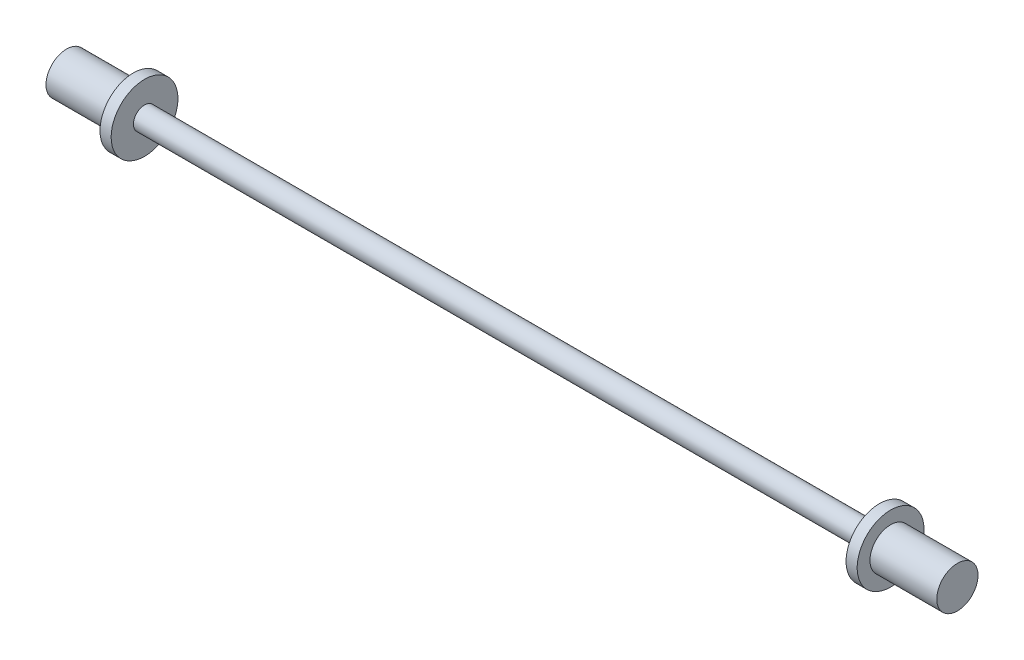
ISO-10303-21;
HEADER;
FILE_DESCRIPTION(('STEP AP214'),'2;1');
FILE_NAME('part.step','',(''),(''),'','','');
FILE_SCHEMA(('AUTOMOTIVE_DESIGN { 1 0 10303 214 1 1 1 1 }'));
ENDSEC;
DATA;
#1=APPLICATION_CONTEXT('core data for automotive mechanical design processes');
#2=APPLICATION_PROTOCOL_DEFINITION('international standard','automotive_design',2000,#1);
#3=PRODUCT_CONTEXT('',#1,'mechanical');
#4=PRODUCT('Part','Part','',(#3));
#5=PRODUCT_RELATED_PRODUCT_CATEGORY('part','',(#4));
#6=PRODUCT_DEFINITION_FORMATION('','',#4);
#7=PRODUCT_DEFINITION_CONTEXT('part definition',#1,'design');
#8=PRODUCT_DEFINITION('design','',#6,#7);
#9=PRODUCT_DEFINITION_SHAPE('','',#8);
#10=(LENGTH_UNIT() NAMED_UNIT(*) SI_UNIT(.MILLI.,.METRE.));
#11=(NAMED_UNIT(*) PLANE_ANGLE_UNIT() SI_UNIT($,.RADIAN.));
#12=(NAMED_UNIT(*) SI_UNIT($,.STERADIAN.) SOLID_ANGLE_UNIT());
#13=UNCERTAINTY_MEASURE_WITH_UNIT(LENGTH_MEASURE(1.E-05),#10,'distance_accuracy_value','');
#14=(GEOMETRIC_REPRESENTATION_CONTEXT(3) GLOBAL_UNCERTAINTY_ASSIGNED_CONTEXT((#13)) GLOBAL_UNIT_ASSIGNED_CONTEXT((#10,
#11,#12)) REPRESENTATION_CONTEXT('',''));
#15=CARTESIAN_POINT('',(0.,0.,0.));
#16=DIRECTION('',(0.,0.,1.));
#17=DIRECTION('',(1.,0.,0.));
#18=AXIS2_PLACEMENT_3D('',#15,#16,#17);
#19=CARTESIAN_POINT('',(-171.45,0.,0.));
#20=DIRECTION('',(1.,0.,0.));
#21=DIRECTION('',(0.,0.,-1.));
#22=AXIS2_PLACEMENT_3D('',#19,#20,#21);
#23=CYLINDRICAL_SURFACE('',#22,6.35);
#24=CARTESIAN_POINT('',(-171.45,0.,0.));
#25=DIRECTION('',(1.,0.,0.));
#26=DIRECTION('',(0.,0.,-1.));
#27=AXIS2_PLACEMENT_3D('',#24,#25,#26);
#28=CIRCLE('',#27,6.35);
#29=CARTESIAN_POINT('',(-171.45,0.,-6.35));
#30=VERTEX_POINT('',#29);
#31=EDGE_CURVE('E46',#30,#30,#28,.T.);
#32=ORIENTED_EDGE('',*,*,#31,.T.);
#33=EDGE_LOOP('',(#32));
#34=FACE_BOUND('',#33,.T.);
#35=CARTESIAN_POINT('',(247.65,0.,0.));
#36=DIRECTION('',(1.,0.,0.));
#37=DIRECTION('',(0.,0.,-1.));
#38=AXIS2_PLACEMENT_3D('',#35,#36,#37);
#39=CIRCLE('',#38,6.35);
#40=CARTESIAN_POINT('',(247.65,0.,-6.35));
#41=VERTEX_POINT('',#40);
#42=EDGE_CURVE('E57',#41,#41,#39,.T.);
#43=ORIENTED_EDGE('',*,*,#42,.F.);
#44=EDGE_LOOP('',(#43));
#45=FACE_BOUND('',#44,.T.);
#46=ADVANCED_FACE('F43',(#34,#45),#23,.T.);
#47=CARTESIAN_POINT('',(254.,0.,0.));
#48=DIRECTION('',(-1.,0.,0.));
#49=DIRECTION('',(0.,0.,1.));
#50=AXIS2_PLACEMENT_3D('',#47,#48,#49);
#51=CYLINDRICAL_SURFACE('',#50,19.05);
#52=CARTESIAN_POINT('',(254.,0.,0.));
#53=DIRECTION('',(1.,0.,0.));
#54=DIRECTION('',(0.,0.,-1.));
#55=AXIS2_PLACEMENT_3D('',#52,#53,#54);
#56=CIRCLE('',#55,19.05);
#57=CARTESIAN_POINT('',(254.,0.,-19.05));
#58=VERTEX_POINT('',#57);
#59=EDGE_CURVE('E74',#58,#58,#56,.T.);
#60=ORIENTED_EDGE('',*,*,#59,.F.);
#61=EDGE_LOOP('',(#60));
#62=FACE_BOUND('',#61,.T.);
#63=CARTESIAN_POINT('',(247.65,0.,0.));
#64=DIRECTION('',(1.,0.,0.));
#65=DIRECTION('',(0.,0.,-1.));
#66=AXIS2_PLACEMENT_3D('',#63,#64,#65);
#67=CIRCLE('',#66,19.05);
#68=CARTESIAN_POINT('',(247.65,0.,-19.05));
#69=VERTEX_POINT('',#68);
#70=EDGE_CURVE('E78',#69,#69,#67,.T.);
#71=ORIENTED_EDGE('',*,*,#70,.T.);
#72=EDGE_LOOP('',(#71));
#73=FACE_BOUND('',#72,.T.);
#74=ADVANCED_FACE('F89',(#62,#73),#51,.T.);
#75=CARTESIAN_POINT('',(254.,0.,0.));
#76=DIRECTION('',(1.,0.,0.));
#77=DIRECTION('',(0.,0.,-1.));
#78=AXIS2_PLACEMENT_3D('',#75,#76,#77);
#79=PLANE('',#78);
#80=CARTESIAN_POINT('',(254.,0.,0.));
#81=DIRECTION('',(1.,0.,0.));
#82=DIRECTION('',(0.,0.,-1.));
#83=AXIS2_PLACEMENT_3D('',#80,#81,#82);
#84=CIRCLE('',#83,11.77);
#85=CARTESIAN_POINT('',(254.,0.,11.77));
#86=VERTEX_POINT('',#85);
#87=EDGE_CURVE('E10',#86,#86,#84,.T.);
#88=ORIENTED_EDGE('',*,*,#87,.F.);
#89=EDGE_LOOP('',(#88));
#90=FACE_BOUND('',#89,.T.);
#91=ORIENTED_EDGE('',*,*,#59,.T.);
#92=EDGE_LOOP('',(#91));
#93=FACE_BOUND('',#92,.T.);
#94=ADVANCED_FACE('F94',(#90,#93),#79,.T.);
#95=CARTESIAN_POINT('',(247.65,0.,0.));
#96=DIRECTION('',(1.,0.,0.));
#97=DIRECTION('',(0.,0.,-1.));
#98=AXIS2_PLACEMENT_3D('',#95,#96,#97);
#99=PLANE('',#98);
#100=ORIENTED_EDGE('',*,*,#42,.T.);
#101=EDGE_LOOP('',(#100));
#102=FACE_BOUND('',#101,.T.);
#103=ORIENTED_EDGE('',*,*,#70,.F.);
#104=EDGE_LOOP('',(#103));
#105=FACE_BOUND('',#104,.T.);
#106=ADVANCED_FACE('F85',(#102,#105),#99,.F.);
#107=CARTESIAN_POINT('',(-177.8,0.,0.));
#108=DIRECTION('',(1.,0.,0.));
#109=DIRECTION('',(0.,0.,-1.));
#110=AXIS2_PLACEMENT_3D('',#107,#108,#109);
#111=CYLINDRICAL_SURFACE('',#110,19.05);
#112=CARTESIAN_POINT('',(-177.8,0.,0.));
#113=DIRECTION('',(-1.,0.,0.));
#114=DIRECTION('',(0.,0.,1.));
#115=AXIS2_PLACEMENT_3D('',#112,#113,#114);
#116=CIRCLE('',#115,19.05);
#117=CARTESIAN_POINT('',(-177.8,0.,19.05));
#118=VERTEX_POINT('',#117);
#119=EDGE_CURVE('E67',#118,#118,#116,.T.);
#120=ORIENTED_EDGE('',*,*,#119,.F.);
#121=EDGE_LOOP('',(#120));
#122=FACE_BOUND('',#121,.T.);
#123=CARTESIAN_POINT('',(-171.45,0.,0.));
#124=DIRECTION('',(-1.,0.,0.));
#125=DIRECTION('',(0.,0.,1.));
#126=AXIS2_PLACEMENT_3D('',#123,#124,#125);
#127=CIRCLE('',#126,19.05);
#128=CARTESIAN_POINT('',(-171.45,0.,19.05));
#129=VERTEX_POINT('',#128);
#130=EDGE_CURVE('E65',#129,#129,#127,.T.);
#131=ORIENTED_EDGE('',*,*,#130,.T.);
#132=EDGE_LOOP('',(#131));
#133=FACE_BOUND('',#132,.T.);
#134=ADVANCED_FACE('F127',(#122,#133),#111,.T.);
#135=CARTESIAN_POINT('',(-177.8,0.,0.));
#136=DIRECTION('',(-1.,0.,0.));
#137=DIRECTION('',(0.,0.,1.));
#138=AXIS2_PLACEMENT_3D('',#135,#136,#137);
#139=PLANE('',#138);
#140=CARTESIAN_POINT('',(-177.8,0.,0.));
#141=DIRECTION('',(-1.,0.,0.));
#142=DIRECTION('',(0.,0.,1.));
#143=AXIS2_PLACEMENT_3D('',#140,#141,#142);
#144=CIRCLE('',#143,11.77);
#145=CARTESIAN_POINT('',(-177.8,0.,-11.77));
#146=VERTEX_POINT('',#145);
#147=EDGE_CURVE('E51',#146,#146,#144,.T.);
#148=ORIENTED_EDGE('',*,*,#147,.F.);
#149=EDGE_LOOP('',(#148));
#150=FACE_BOUND('',#149,.T.);
#151=ORIENTED_EDGE('',*,*,#119,.T.);
#152=EDGE_LOOP('',(#151));
#153=FACE_BOUND('',#152,.T.);
#154=ADVANCED_FACE('F124',(#150,#153),#139,.T.);
#155=CARTESIAN_POINT('',(-171.45,0.,0.));
#156=DIRECTION('',(-1.,0.,0.));
#157=DIRECTION('',(0.,0.,1.));
#158=AXIS2_PLACEMENT_3D('',#155,#156,#157);
#159=PLANE('',#158);
#160=ORIENTED_EDGE('',*,*,#31,.F.);
#161=EDGE_LOOP('',(#160));
#162=FACE_BOUND('',#161,.T.);
#163=ORIENTED_EDGE('',*,*,#130,.F.);
#164=EDGE_LOOP('',(#163));
#165=FACE_BOUND('',#164,.T.);
#166=ADVANCED_FACE('F122',(#162,#165),#159,.F.);
#167=CARTESIAN_POINT('',(-215.9,0.,0.));
#168=DIRECTION('',(1.,0.,0.));
#169=DIRECTION('',(0.,0.,-1.));
#170=AXIS2_PLACEMENT_3D('',#167,#168,#169);
#171=CYLINDRICAL_SURFACE('',#170,11.77);
#172=CARTESIAN_POINT('',(-215.9,0.,0.));
#173=DIRECTION('',(-1.,0.,0.));
#174=DIRECTION('',(0.,0.,1.));
#175=AXIS2_PLACEMENT_3D('',#172,#173,#174);
#176=CIRCLE('',#175,11.77);
#177=CARTESIAN_POINT('',(-215.9,0.,-11.77));
#178=VERTEX_POINT('',#177);
#179=EDGE_CURVE('E62',#178,#178,#176,.T.);
#180=CARTESIAN_POINT('',(-215.9,0.,-11.77));
#181=CARTESIAN_POINT('',(-215.503125,0.,-11.77));
#182=CARTESIAN_POINT('',(-215.10625,0.,-11.77));
#183=CARTESIAN_POINT('',(-214.3125,0.,-11.77));
#184=CARTESIAN_POINT('',(-213.915625,0.,-11.77));
#185=CARTESIAN_POINT('',(-213.121875,0.,-11.77));
#186=CARTESIAN_POINT('',(-212.725,0.,-11.77));
#187=CARTESIAN_POINT('',(-211.93125,0.,-11.77));
#188=CARTESIAN_POINT('',(-211.534375,0.,-11.77));
#189=CARTESIAN_POINT('',(-210.740625,0.,-11.77));
#190=CARTESIAN_POINT('',(-210.34375,0.,-11.77));
#191=CARTESIAN_POINT('',(-209.55,0.,-11.77));
#192=CARTESIAN_POINT('',(-209.153125,0.,-11.77));
#193=CARTESIAN_POINT('',(-208.359375,0.,-11.77));
#194=CARTESIAN_POINT('',(-207.9625,0.,-11.77));
#195=CARTESIAN_POINT('',(-207.16875,0.,-11.77));
#196=CARTESIAN_POINT('',(-206.771875,0.,-11.77));
#197=CARTESIAN_POINT('',(-205.978125,0.,-11.77));
#198=CARTESIAN_POINT('',(-205.58125,0.,-11.77));
#199=CARTESIAN_POINT('',(-204.7875,0.,-11.77));
#200=CARTESIAN_POINT('',(-204.390625,0.,-11.77));
#201=CARTESIAN_POINT('',(-203.596875,0.,-11.77));
#202=CARTESIAN_POINT('',(-203.2,0.,-11.77));
#203=CARTESIAN_POINT('',(-202.40625,0.,-11.77));
#204=CARTESIAN_POINT('',(-202.009375,0.,-11.77));
#205=CARTESIAN_POINT('',(-201.215625,0.,-11.77));
#206=CARTESIAN_POINT('',(-200.81875,0.,-11.77));
#207=CARTESIAN_POINT('',(-200.025,0.,-11.77));
#208=CARTESIAN_POINT('',(-199.628125,0.,-11.77));
#209=CARTESIAN_POINT('',(-198.834375,0.,-11.77));
#210=CARTESIAN_POINT('',(-198.4375,0.,-11.77));
#211=CARTESIAN_POINT('',(-197.64375,0.,-11.77));
#212=CARTESIAN_POINT('',(-197.246875,0.,-11.77));
#213=CARTESIAN_POINT('',(-196.453125,0.,-11.77));
#214=CARTESIAN_POINT('',(-196.05625,0.,-11.77));
#215=CARTESIAN_POINT('',(-195.2625,0.,-11.77));
#216=CARTESIAN_POINT('',(-194.865625,0.,-11.77));
#217=CARTESIAN_POINT('',(-194.071875,0.,-11.77));
#218=CARTESIAN_POINT('',(-193.675,0.,-11.77));
#219=CARTESIAN_POINT('',(-192.88125,0.,-11.77));
#220=CARTESIAN_POINT('',(-192.484375,0.,-11.77));
#221=CARTESIAN_POINT('',(-191.690625,0.,-11.77));
#222=CARTESIAN_POINT('',(-191.29375,0.,-11.77));
#223=CARTESIAN_POINT('',(-190.5,0.,-11.77));
#224=CARTESIAN_POINT('',(-190.103125,0.,-11.77));
#225=CARTESIAN_POINT('',(-189.309375,0.,-11.77));
#226=CARTESIAN_POINT('',(-188.9125,0.,-11.77));
#227=CARTESIAN_POINT('',(-188.11875,0.,-11.77));
#228=CARTESIAN_POINT('',(-187.721875,0.,-11.77));
#229=CARTESIAN_POINT('',(-186.928125,0.,-11.77));
#230=CARTESIAN_POINT('',(-186.53125,0.,-11.77));
#231=CARTESIAN_POINT('',(-185.7375,0.,-11.77));
#232=CARTESIAN_POINT('',(-185.340625,0.,-11.77));
#233=CARTESIAN_POINT('',(-184.546875,0.,-11.77));
#234=CARTESIAN_POINT('',(-184.15,0.,-11.77));
#235=CARTESIAN_POINT('',(-183.35625,0.,-11.77));
#236=CARTESIAN_POINT('',(-182.959375,0.,-11.77));
#237=CARTESIAN_POINT('',(-182.165625,0.,-11.77));
#238=CARTESIAN_POINT('',(-181.76875,0.,-11.77));
#239=CARTESIAN_POINT('',(-180.975,0.,-11.77));
#240=CARTESIAN_POINT('',(-180.578125,0.,-11.77));
#241=CARTESIAN_POINT('',(-179.784375,0.,-11.77));
#242=CARTESIAN_POINT('',(-179.3875,0.,-11.77));
#243=CARTESIAN_POINT('',(-178.59375,0.,-11.77));
#244=CARTESIAN_POINT('',(-178.196875,0.,-11.77));
#245=CARTESIAN_POINT('',(-177.8,0.,-11.77));
#246=B_SPLINE_CURVE_WITH_KNOTS('',3,(#180,#181,#182,#183,#184,#185,#186,#187,#188,#189,#190,
#191,#192,#193,#194,#195,#196,#197,#198,#199,#200,#201,#202,#203,#204,#205,#206,#207,#208,#209,
#210,#211,#212,#213,#214,#215,#216,#217,#218,#219,#220,#221,#222,#223,#224,#225,#226,#227,#228,
#229,#230,#231,#232,#233,#234,#235,#236,#237,#238,#239,#240,#241,#242,#243,#244,#245),
.UNSPECIFIED.,.F.,.F.,(4,2,2,2,2,2,2,2,2,2,2,2,2,2,2,2,2,2,2,2,2,2,2,2,2,2,2,2,2,2,2,2,4),(0.,
1.19062499999997,2.38124999999997,3.57187499999997,4.76249999999998,5.95312499999998,
7.14374999999998,8.33437499999998,9.52499999999998,10.715625,11.90625,13.096875,14.2875,
15.478125,16.66875,17.859375,19.05,20.240625,21.43125,22.621875,23.8125,25.003125,26.19375,
27.384375,28.575,29.765625,30.95625,32.146875,33.3375,34.528125,35.71875,36.909375,38.1),.UNSPECIFIED.);
#247=EDGE_CURVE('BSEAM116',#178,#146,#246,.T.);
#248=ORIENTED_EDGE('',*,*,#179,.F.);
#249=ORIENTED_EDGE('',*,*,#147,.T.);
#250=ORIENTED_EDGE('',*,*,#247,.T.);
#251=ORIENTED_EDGE('',*,*,#247,.F.);
#252=EDGE_LOOP('',(#248,#250,#249,#251));
#253=FACE_BOUND('',#252,.T.);
#254=ADVANCED_FACE('F116',(#253),#171,.T.);
#255=CARTESIAN_POINT('',(-215.9,0.,0.));
#256=DIRECTION('',(-1.,0.,0.));
#257=DIRECTION('',(0.,0.,1.));
#258=AXIS2_PLACEMENT_3D('',#255,#256,#257);
#259=PLANE('',#258);
#260=ORIENTED_EDGE('',*,*,#179,.T.);
#261=EDGE_LOOP('',(#260));
#262=FACE_BOUND('',#261,.T.);
#263=ADVANCED_FACE('F108',(#262),#259,.T.);
#264=CARTESIAN_POINT('',(292.1,0.,0.));
#265=DIRECTION('',(-1.,0.,0.));
#266=DIRECTION('',(0.,0.,1.));
#267=AXIS2_PLACEMENT_3D('',#264,#265,#266);
#268=CYLINDRICAL_SURFACE('',#267,11.77);
#269=CARTESIAN_POINT('',(292.1,0.,0.));
#270=DIRECTION('',(1.,0.,0.));
#271=DIRECTION('',(0.,0.,-1.));
#272=AXIS2_PLACEMENT_3D('',#269,#270,#271);
#273=CIRCLE('',#272,11.77);
#274=CARTESIAN_POINT('',(292.1,0.,11.77));
#275=VERTEX_POINT('',#274);
#276=EDGE_CURVE('E61',#275,#275,#273,.T.);
#277=CARTESIAN_POINT('',(292.1,0.,11.77));
#278=CARTESIAN_POINT('',(291.703125,0.,11.77));
#279=CARTESIAN_POINT('',(291.30625,0.,11.77));
#280=CARTESIAN_POINT('',(290.5125,0.,11.77));
#281=CARTESIAN_POINT('',(290.115625,0.,11.77));
#282=CARTESIAN_POINT('',(289.321875,0.,11.77));
#283=CARTESIAN_POINT('',(288.925,0.,11.77));
#284=CARTESIAN_POINT('',(288.13125,0.,11.77));
#285=CARTESIAN_POINT('',(287.734375,0.,11.77));
#286=CARTESIAN_POINT('',(286.940625,0.,11.77));
#287=CARTESIAN_POINT('',(286.54375,0.,11.77));
#288=CARTESIAN_POINT('',(285.75,0.,11.77));
#289=CARTESIAN_POINT('',(285.353125,0.,11.77));
#290=CARTESIAN_POINT('',(284.559375,0.,11.77));
#291=CARTESIAN_POINT('',(284.1625,0.,11.77));
#292=CARTESIAN_POINT('',(283.36875,0.,11.77));
#293=CARTESIAN_POINT('',(282.971875,0.,11.77));
#294=CARTESIAN_POINT('',(282.178125,0.,11.77));
#295=CARTESIAN_POINT('',(281.78125,0.,11.77));
#296=CARTESIAN_POINT('',(280.9875,0.,11.77));
#297=CARTESIAN_POINT('',(280.590625,0.,11.77));
#298=CARTESIAN_POINT('',(279.796875,0.,11.77));
#299=CARTESIAN_POINT('',(279.4,0.,11.77));
#300=CARTESIAN_POINT('',(278.60625,0.,11.77));
#301=CARTESIAN_POINT('',(278.209375,0.,11.77));
#302=CARTESIAN_POINT('',(277.415625,0.,11.77));
#303=CARTESIAN_POINT('',(277.01875,0.,11.77));
#304=CARTESIAN_POINT('',(276.225,0.,11.77));
#305=CARTESIAN_POINT('',(275.828125,0.,11.77));
#306=CARTESIAN_POINT('',(275.034375,0.,11.77));
#307=CARTESIAN_POINT('',(274.6375,0.,11.77));
#308=CARTESIAN_POINT('',(273.84375,0.,11.77));
#309=CARTESIAN_POINT('',(273.446875,0.,11.77));
#310=CARTESIAN_POINT('',(272.653125,0.,11.77));
#311=CARTESIAN_POINT('',(272.25625,0.,11.77));
#312=CARTESIAN_POINT('',(271.4625,0.,11.77));
#313=CARTESIAN_POINT('',(271.065625,0.,11.77));
#314=CARTESIAN_POINT('',(270.271875,0.,11.77));
#315=CARTESIAN_POINT('',(269.875,0.,11.77));
#316=CARTESIAN_POINT('',(269.08125,0.,11.77));
#317=CARTESIAN_POINT('',(268.684375,0.,11.77));
#318=CARTESIAN_POINT('',(267.890625,0.,11.77));
#319=CARTESIAN_POINT('',(267.49375,0.,11.77));
#320=CARTESIAN_POINT('',(266.7,0.,11.77));
#321=CARTESIAN_POINT('',(266.303125,0.,11.77));
#322=CARTESIAN_POINT('',(265.509375,0.,11.77));
#323=CARTESIAN_POINT('',(265.1125,0.,11.77));
#324=CARTESIAN_POINT('',(264.31875,0.,11.77));
#325=CARTESIAN_POINT('',(263.921875,0.,11.77));
#326=CARTESIAN_POINT('',(263.128125,0.,11.77));
#327=CARTESIAN_POINT('',(262.73125,0.,11.77));
#328=CARTESIAN_POINT('',(261.9375,0.,11.77));
#329=CARTESIAN_POINT('',(261.540625,0.,11.77));
#330=CARTESIAN_POINT('',(260.746875,0.,11.77));
#331=CARTESIAN_POINT('',(260.35,0.,11.77));
#332=CARTESIAN_POINT('',(259.55625,0.,11.77));
#333=CARTESIAN_POINT('',(259.159375,0.,11.77));
#334=CARTESIAN_POINT('',(258.365625,0.,11.77));
#335=CARTESIAN_POINT('',(257.96875,0.,11.77));
#336=CARTESIAN_POINT('',(257.175,0.,11.77));
#337=CARTESIAN_POINT('',(256.778125,0.,11.77));
#338=CARTESIAN_POINT('',(255.984375,0.,11.77));
#339=CARTESIAN_POINT('',(255.5875,0.,11.77));
#340=CARTESIAN_POINT('',(254.79375,0.,11.77));
#341=CARTESIAN_POINT('',(254.396875,0.,11.77));
#342=CARTESIAN_POINT('',(254.,0.,11.77));
#343=B_SPLINE_CURVE_WITH_KNOTS('',3,(#277,#278,#279,#280,#281,#282,#283,#284,#285,#286,#287,
#288,#289,#290,#291,#292,#293,#294,#295,#296,#297,#298,#299,#300,#301,#302,#303,#304,#305,#306,
#307,#308,#309,#310,#311,#312,#313,#314,#315,#316,#317,#318,#319,#320,#321,#322,#323,#324,#325,
#326,#327,#328,#329,#330,#331,#332,#333,#334,#335,#336,#337,#338,#339,#340,#341,#342),
.UNSPECIFIED.,.F.,.F.,(4,2,2,2,2,2,2,2,2,2,2,2,2,2,2,2,2,2,2,2,2,2,2,2,2,2,2,2,2,2,2,2,4),(0.,
1.190625,2.38125,3.571875,4.7625,5.953125,7.14375,8.334375,9.52500000000001,10.715625,11.90625,
13.096875,14.2875,15.478125,16.66875,17.859375,19.05,20.240625,21.43125,22.621875,23.8125,
25.003125,26.19375,27.384375,28.575,29.765625,30.95625,32.146875,33.3375,34.528125,35.71875,
36.909375,38.1),.UNSPECIFIED.);
#344=EDGE_CURVE('BSEAM106',#275,#86,#343,.T.);
#345=ORIENTED_EDGE('',*,*,#276,.F.);
#346=ORIENTED_EDGE('',*,*,#87,.T.);
#347=ORIENTED_EDGE('',*,*,#344,.T.);
#348=ORIENTED_EDGE('',*,*,#344,.F.);
#349=EDGE_LOOP('',(#345,#347,#346,#348));
#350=FACE_BOUND('',#349,.T.);
#351=ADVANCED_FACE('F106',(#350),#268,.T.);
#352=CARTESIAN_POINT('',(292.1,0.,0.));
#353=DIRECTION('',(1.,0.,0.));
#354=DIRECTION('',(0.,0.,-1.));
#355=AXIS2_PLACEMENT_3D('',#352,#353,#354);
#356=PLANE('',#355);
#357=ORIENTED_EDGE('',*,*,#276,.T.);
#358=EDGE_LOOP('',(#357));
#359=FACE_BOUND('',#358,.T.);
#360=ADVANCED_FACE('F104',(#359),#356,.T.);
#361=CLOSED_SHELL('',(#46,#74,#94,#106,#134,#154,#166,#254,#263,#351,#360));
#362=MANIFOLD_SOLID_BREP('B2',#361);
#363=ADVANCED_BREP_SHAPE_REPRESENTATION('',(#18,#362),#14);
#364=SHAPE_DEFINITION_REPRESENTATION(#9,#363);
ENDSEC;
END-ISO-10303-21;
